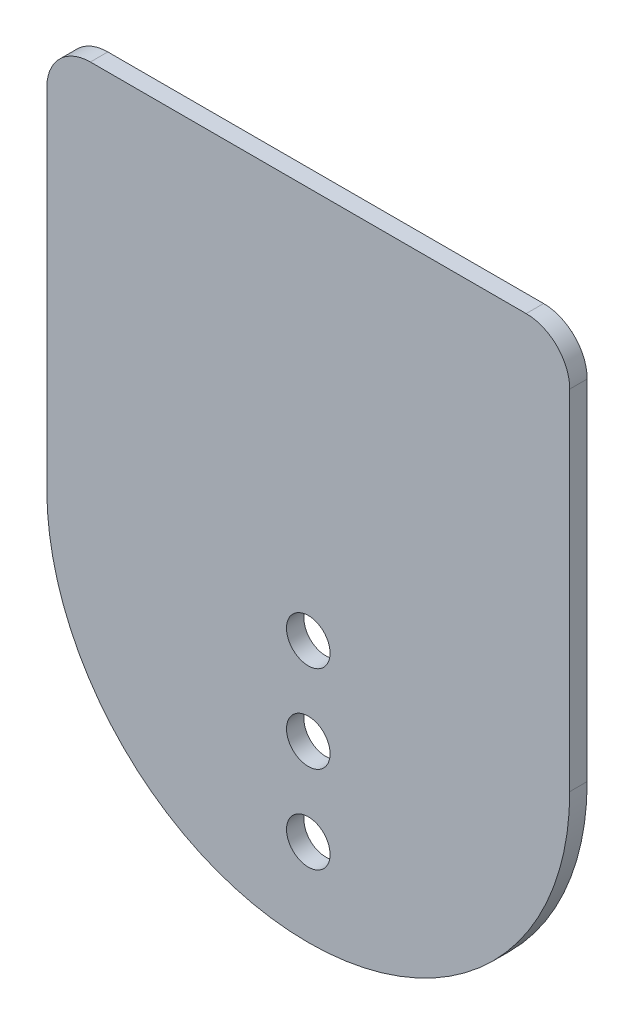
ISO-10303-21;
HEADER;
FILE_DESCRIPTION(('STEP AP214'),'2;1');
FILE_NAME('part.step','',(''),(''),'','','');
FILE_SCHEMA(('AUTOMOTIVE_DESIGN { 1 0 10303 214 1 1 1 1 }'));
ENDSEC;
DATA;
#1=APPLICATION_CONTEXT('core data for automotive mechanical design processes');
#2=APPLICATION_PROTOCOL_DEFINITION('international standard','automotive_design',2000,#1);
#3=PRODUCT_CONTEXT('',#1,'mechanical');
#4=PRODUCT('Part','Part','',(#3));
#5=PRODUCT_RELATED_PRODUCT_CATEGORY('part','',(#4));
#6=PRODUCT_DEFINITION_FORMATION('','',#4);
#7=PRODUCT_DEFINITION_CONTEXT('part definition',#1,'design');
#8=PRODUCT_DEFINITION('design','',#6,#7);
#9=PRODUCT_DEFINITION_SHAPE('','',#8);
#10=(LENGTH_UNIT() NAMED_UNIT(*) SI_UNIT(.MILLI.,.METRE.));
#11=(NAMED_UNIT(*) PLANE_ANGLE_UNIT() SI_UNIT($,.RADIAN.));
#12=(NAMED_UNIT(*) SI_UNIT($,.STERADIAN.) SOLID_ANGLE_UNIT());
#13=UNCERTAINTY_MEASURE_WITH_UNIT(LENGTH_MEASURE(1.E-05),#10,'distance_accuracy_value','');
#14=(GEOMETRIC_REPRESENTATION_CONTEXT(3) GLOBAL_UNCERTAINTY_ASSIGNED_CONTEXT((#13)) GLOBAL_UNIT_ASSIGNED_CONTEXT((#10,
#11,#12)) REPRESENTATION_CONTEXT('',''));
#15=CARTESIAN_POINT('',(0.,0.,0.));
#16=DIRECTION('',(0.,0.,1.));
#17=DIRECTION('',(1.,0.,0.));
#18=AXIS2_PLACEMENT_3D('',#15,#16,#17);
#19=CARTESIAN_POINT('',(10.,-10.,2.));
#20=DIRECTION('',(0.,0.,-1.));
#21=DIRECTION('',(-1.,0.,0.));
#22=AXIS2_PLACEMENT_3D('',#19,#20,#21);
#23=PLANE('',#22);
#24=CARTESIAN_POINT('',(10.,-10.,2.));
#25=DIRECTION('',(0.,0.,1.));
#26=DIRECTION('',(-1.,0.,0.));
#27=AXIS2_PLACEMENT_3D('',#24,#25,#26);
#28=CIRCLE('',#27,10.);
#29=CARTESIAN_POINT('',(10.0000000000001,0.,2.));
#30=VERTEX_POINT('',#29);
#31=CARTESIAN_POINT('',(0.,-10.0000000000001,2.));
#32=VERTEX_POINT('',#31);
#33=EDGE_CURVE('E136',#30,#32,#28,.T.);
#34=ORIENTED_EDGE('',*,*,#33,.T.);
#35=DIRECTION('',(0.,-1.,0.));
#36=VECTOR('',#35,1.);
#37=CARTESIAN_POINT('',(0.,-10.0000000000001,2.));
#38=LINE('',#37,#36);
#39=CARTESIAN_POINT('',(0.,-90.,2.));
#40=VERTEX_POINT('',#39);
#41=EDGE_CURVE('E93',#32,#40,#38,.T.);
#42=ORIENTED_EDGE('',*,*,#41,.T.);
#43=CARTESIAN_POINT('',(60.,-90.,2.));
#44=DIRECTION('',(0.,0.,1.));
#45=DIRECTION('',(-1.,0.,0.));
#46=AXIS2_PLACEMENT_3D('',#43,#44,#45);
#47=CIRCLE('',#46,60.);
#48=CARTESIAN_POINT('',(120.,-90.,2.));
#49=VERTEX_POINT('',#48);
#50=EDGE_CURVE('E106',#40,#49,#47,.T.);
#51=ORIENTED_EDGE('',*,*,#50,.T.);
#52=DIRECTION('',(0.,1.,0.));
#53=VECTOR('',#52,1.);
#54=CARTESIAN_POINT('',(120.,-10.,2.));
#55=LINE('',#54,#53);
#56=CARTESIAN_POINT('',(120.,-10.,2.));
#57=VERTEX_POINT('',#56);
#58=EDGE_CURVE('E100',#49,#57,#55,.T.);
#59=ORIENTED_EDGE('',*,*,#58,.T.);
#60=CARTESIAN_POINT('',(110.,-10.,2.));
#61=DIRECTION('',(0.,0.,1.));
#62=DIRECTION('',(1.,0.,0.));
#63=AXIS2_PLACEMENT_3D('',#60,#61,#62);
#64=CIRCLE('',#63,10.);
#65=CARTESIAN_POINT('',(110.,0.,2.));
#66=VERTEX_POINT('',#65);
#67=EDGE_CURVE('E104',#57,#66,#64,.T.);
#68=ORIENTED_EDGE('',*,*,#67,.T.);
#69=DIRECTION('',(-1.,0.,0.));
#70=VECTOR('',#69,1.);
#71=CARTESIAN_POINT('',(10.0000000000001,0.,2.));
#72=LINE('',#71,#70);
#73=EDGE_CURVE('E56',#66,#30,#72,.T.);
#74=ORIENTED_EDGE('',*,*,#73,.T.);
#75=EDGE_LOOP('',(#34,#42,#51,#59,#68,#74));
#76=FACE_BOUND('',#75,.T.);
#77=CARTESIAN_POINT('',(60.0000000000001,-130.,2.));
#78=DIRECTION('',(0.,0.,1.));
#79=DIRECTION('',(1.,0.,0.));
#80=AXIS2_PLACEMENT_3D('',#77,#78,#79);
#81=CIRCLE('',#80,5.);
#82=CARTESIAN_POINT('',(65.0000000000001,-130.,2.));
#83=VERTEX_POINT('',#82);
#84=EDGE_CURVE('E128',#83,#83,#81,.T.);
#85=ORIENTED_EDGE('',*,*,#84,.F.);
#86=EDGE_LOOP('',(#85));
#87=FACE_BOUND('',#86,.T.);
#88=CARTESIAN_POINT('',(60.0000000000001,-110.,2.));
#89=DIRECTION('',(0.,0.,1.));
#90=DIRECTION('',(1.,0.,0.));
#91=AXIS2_PLACEMENT_3D('',#88,#89,#90);
#92=CIRCLE('',#91,5.);
#93=CARTESIAN_POINT('',(65.0000000000001,-110.,2.));
#94=VERTEX_POINT('',#93);
#95=EDGE_CURVE('E190',#94,#94,#92,.T.);
#96=ORIENTED_EDGE('',*,*,#95,.F.);
#97=EDGE_LOOP('',(#96));
#98=FACE_BOUND('',#97,.T.);
#99=CARTESIAN_POINT('',(60.,-90.,2.));
#100=DIRECTION('',(0.,0.,1.));
#101=DIRECTION('',(1.,0.,0.));
#102=AXIS2_PLACEMENT_3D('',#99,#100,#101);
#103=CIRCLE('',#102,5.);
#104=CARTESIAN_POINT('',(65.,-90.,2.));
#105=VERTEX_POINT('',#104);
#106=EDGE_CURVE('E181',#105,#105,#103,.T.);
#107=ORIENTED_EDGE('',*,*,#106,.F.);
#108=EDGE_LOOP('',(#107));
#109=FACE_BOUND('',#108,.T.);
#110=ADVANCED_FACE('F39',(#76,#87,#98,#109),#23,.F.);
#111=CARTESIAN_POINT('',(10.,-10.,-2.));
#112=DIRECTION('',(0.,0.,-1.));
#113=DIRECTION('',(-1.,0.,0.));
#114=AXIS2_PLACEMENT_3D('',#111,#112,#113);
#115=PLANE('',#114);
#116=CARTESIAN_POINT('',(60.0000000000001,-110.,-2.));
#117=DIRECTION('',(0.,0.,1.));
#118=DIRECTION('',(1.,0.,0.));
#119=AXIS2_PLACEMENT_3D('',#116,#117,#118);
#120=CIRCLE('',#119,5.);
#121=CARTESIAN_POINT('',(65.0000000000001,-110.,-2.));
#122=VERTEX_POINT('',#121);
#123=EDGE_CURVE('E187',#122,#122,#120,.T.);
#124=ORIENTED_EDGE('',*,*,#123,.T.);
#125=EDGE_LOOP('',(#124));
#126=FACE_BOUND('',#125,.T.);
#127=CARTESIAN_POINT('',(10.,-10.,-2.));
#128=DIRECTION('',(0.,0.,1.));
#129=DIRECTION('',(-1.,0.,0.));
#130=AXIS2_PLACEMENT_3D('',#127,#128,#129);
#131=CIRCLE('',#130,10.);
#132=CARTESIAN_POINT('',(10.0000000000001,0.,-2.));
#133=VERTEX_POINT('',#132);
#134=CARTESIAN_POINT('',(0.,-10.0000000000001,-2.));
#135=VERTEX_POINT('',#134);
#136=EDGE_CURVE('E124',#133,#135,#131,.T.);
#137=ORIENTED_EDGE('',*,*,#136,.F.);
#138=DIRECTION('',(-1.,0.,0.));
#139=VECTOR('',#138,1.);
#140=CARTESIAN_POINT('',(10.0000000000001,0.,-2.));
#141=LINE('',#140,#139);
#142=CARTESIAN_POINT('',(110.,0.,-2.));
#143=VERTEX_POINT('',#142);
#144=EDGE_CURVE('E85',#143,#133,#141,.T.);
#145=ORIENTED_EDGE('',*,*,#144,.F.);
#146=CARTESIAN_POINT('',(110.,-10.,-2.));
#147=DIRECTION('',(0.,0.,1.));
#148=DIRECTION('',(1.,0.,0.));
#149=AXIS2_PLACEMENT_3D('',#146,#147,#148);
#150=CIRCLE('',#149,10.);
#151=CARTESIAN_POINT('',(120.,-10.,-2.));
#152=VERTEX_POINT('',#151);
#153=EDGE_CURVE('E79',#152,#143,#150,.T.);
#154=ORIENTED_EDGE('',*,*,#153,.F.);
#155=DIRECTION('',(0.,1.,0.));
#156=VECTOR('',#155,1.);
#157=CARTESIAN_POINT('',(120.,-10.,-2.));
#158=LINE('',#157,#156);
#159=CARTESIAN_POINT('',(120.,-90.,-2.));
#160=VERTEX_POINT('',#159);
#161=EDGE_CURVE('E114',#160,#152,#158,.T.);
#162=ORIENTED_EDGE('',*,*,#161,.F.);
#163=CARTESIAN_POINT('',(60.,-90.,-2.));
#164=DIRECTION('',(0.,0.,1.));
#165=DIRECTION('',(1.,0.,0.));
#166=AXIS2_PLACEMENT_3D('',#163,#164,#165);
#167=CIRCLE('',#166,60.);
#168=CARTESIAN_POINT('',(0.,-90.,-2.));
#169=VERTEX_POINT('',#168);
#170=EDGE_CURVE('E131',#169,#160,#167,.T.);
#171=ORIENTED_EDGE('',*,*,#170,.F.);
#172=DIRECTION('',(0.,-1.,0.));
#173=VECTOR('',#172,1.);
#174=CARTESIAN_POINT('',(0.,-10.0000000000001,-2.));
#175=LINE('',#174,#173);
#176=EDGE_CURVE('E127',#135,#169,#175,.T.);
#177=ORIENTED_EDGE('',*,*,#176,.F.);
#178=EDGE_LOOP('',(#137,#145,#154,#162,#171,#177));
#179=FACE_BOUND('',#178,.T.);
#180=CARTESIAN_POINT('',(60.0000000000001,-130.,-2.));
#181=DIRECTION('',(0.,0.,1.));
#182=DIRECTION('',(1.,0.,0.));
#183=AXIS2_PLACEMENT_3D('',#180,#181,#182);
#184=CIRCLE('',#183,5.);
#185=CARTESIAN_POINT('',(65.0000000000001,-130.,-2.));
#186=VERTEX_POINT('',#185);
#187=EDGE_CURVE('E193',#186,#186,#184,.T.);
#188=ORIENTED_EDGE('',*,*,#187,.T.);
#189=EDGE_LOOP('',(#188));
#190=FACE_BOUND('',#189,.T.);
#191=CARTESIAN_POINT('',(60.,-90.,-2.));
#192=DIRECTION('',(0.,0.,1.));
#193=DIRECTION('',(1.,0.,0.));
#194=AXIS2_PLACEMENT_3D('',#191,#192,#193);
#195=CIRCLE('',#194,5.);
#196=CARTESIAN_POINT('',(65.,-90.,-2.));
#197=VERTEX_POINT('',#196);
#198=EDGE_CURVE('E184',#197,#197,#195,.T.);
#199=ORIENTED_EDGE('',*,*,#198,.T.);
#200=EDGE_LOOP('',(#199));
#201=FACE_BOUND('',#200,.T.);
#202=ADVANCED_FACE('F146',(#126,#179,#190,#201),#115,.T.);
#203=CARTESIAN_POINT('',(10.,-10.,2.));
#204=DIRECTION('',(0.,0.,-1.));
#205=DIRECTION('',(-1.,0.,0.));
#206=AXIS2_PLACEMENT_3D('',#203,#204,#205);
#207=CYLINDRICAL_SURFACE('',#206,10.);
#208=ORIENTED_EDGE('',*,*,#136,.T.);
#209=DIRECTION('',(0.,0.,-1.));
#210=VECTOR('',#209,1.);
#211=CARTESIAN_POINT('',(0.,-10.0000000000001,2.));
#212=LINE('',#211,#210);
#213=EDGE_CURVE('E11',#32,#135,#212,.T.);
#214=ORIENTED_EDGE('',*,*,#213,.F.);
#215=ORIENTED_EDGE('',*,*,#33,.F.);
#216=DIRECTION('',(0.,0.,-1.));
#217=VECTOR('',#216,1.);
#218=CARTESIAN_POINT('',(10.0000000000001,0.,2.));
#219=LINE('',#218,#217);
#220=EDGE_CURVE('E120',#30,#133,#219,.T.);
#221=ORIENTED_EDGE('',*,*,#220,.T.);
#222=EDGE_LOOP('',(#208,#214,#215,#221));
#223=FACE_BOUND('',#222,.T.);
#224=ADVANCED_FACE('F41',(#223),#207,.T.);
#225=CARTESIAN_POINT('',(0.,-10.0000000000001,2.));
#226=DIRECTION('',(1.,0.,0.));
#227=DIRECTION('',(0.,1.,0.));
#228=AXIS2_PLACEMENT_3D('',#225,#226,#227);
#229=PLANE('',#228);
#230=ORIENTED_EDGE('',*,*,#176,.T.);
#231=DIRECTION('',(0.,0.,-1.));
#232=VECTOR('',#231,1.);
#233=CARTESIAN_POINT('',(0.,-90.,2.));
#234=LINE('',#233,#232);
#235=EDGE_CURVE('E48',#40,#169,#234,.T.);
#236=ORIENTED_EDGE('',*,*,#235,.F.);
#237=ORIENTED_EDGE('',*,*,#41,.F.);
#238=ORIENTED_EDGE('',*,*,#213,.T.);
#239=EDGE_LOOP('',(#230,#236,#237,#238));
#240=FACE_BOUND('',#239,.T.);
#241=ADVANCED_FACE('F142',(#240),#229,.F.);
#242=CARTESIAN_POINT('',(60.,-90.,2.));
#243=DIRECTION('',(0.,0.,-1.));
#244=DIRECTION('',(-1.,0.,0.));
#245=AXIS2_PLACEMENT_3D('',#242,#243,#244);
#246=CYLINDRICAL_SURFACE('',#245,60.);
#247=ORIENTED_EDGE('',*,*,#170,.T.);
#248=DIRECTION('',(0.,0.,-1.));
#249=VECTOR('',#248,1.);
#250=CARTESIAN_POINT('',(120.,-90.,2.));
#251=LINE('',#250,#249);
#252=EDGE_CURVE('E115',#49,#160,#251,.T.);
#253=ORIENTED_EDGE('',*,*,#252,.F.);
#254=ORIENTED_EDGE('',*,*,#50,.F.);
#255=ORIENTED_EDGE('',*,*,#235,.T.);
#256=EDGE_LOOP('',(#247,#253,#254,#255));
#257=FACE_BOUND('',#256,.T.);
#258=ADVANCED_FACE('F141',(#257),#246,.T.);
#259=CARTESIAN_POINT('',(120.,-10.,2.));
#260=DIRECTION('',(-1.,0.,0.));
#261=DIRECTION('',(0.,0.,1.));
#262=AXIS2_PLACEMENT_3D('',#259,#260,#261);
#263=PLANE('',#262);
#264=ORIENTED_EDGE('',*,*,#161,.T.);
#265=DIRECTION('',(0.,0.,-1.));
#266=VECTOR('',#265,1.);
#267=CARTESIAN_POINT('',(120.,-10.,2.));
#268=LINE('',#267,#266);
#269=EDGE_CURVE('E111',#57,#152,#268,.T.);
#270=ORIENTED_EDGE('',*,*,#269,.F.);
#271=ORIENTED_EDGE('',*,*,#58,.F.);
#272=ORIENTED_EDGE('',*,*,#252,.T.);
#273=EDGE_LOOP('',(#264,#270,#271,#272));
#274=FACE_BOUND('',#273,.T.);
#275=ADVANCED_FACE('F112',(#274),#263,.F.);
#276=CARTESIAN_POINT('',(110.,-10.,2.));
#277=DIRECTION('',(0.,0.,-1.));
#278=DIRECTION('',(-1.,0.,0.));
#279=AXIS2_PLACEMENT_3D('',#276,#277,#278);
#280=CYLINDRICAL_SURFACE('',#279,10.);
#281=ORIENTED_EDGE('',*,*,#153,.T.);
#282=DIRECTION('',(0.,0.,-1.));
#283=VECTOR('',#282,1.);
#284=CARTESIAN_POINT('',(110.,0.,2.));
#285=LINE('',#284,#283);
#286=EDGE_CURVE('E116',#66,#143,#285,.T.);
#287=ORIENTED_EDGE('',*,*,#286,.F.);
#288=ORIENTED_EDGE('',*,*,#67,.F.);
#289=ORIENTED_EDGE('',*,*,#269,.T.);
#290=EDGE_LOOP('',(#281,#287,#288,#289));
#291=FACE_BOUND('',#290,.T.);
#292=ADVANCED_FACE('F118',(#291),#280,.T.);
#293=CARTESIAN_POINT('',(10.0000000000001,0.,2.));
#294=DIRECTION('',(0.,-1.,0.));
#295=DIRECTION('',(0.,0.,-1.));
#296=AXIS2_PLACEMENT_3D('',#293,#294,#295);
#297=PLANE('',#296);
#298=ORIENTED_EDGE('',*,*,#144,.T.);
#299=ORIENTED_EDGE('',*,*,#220,.F.);
#300=ORIENTED_EDGE('',*,*,#73,.F.);
#301=ORIENTED_EDGE('',*,*,#286,.T.);
#302=EDGE_LOOP('',(#298,#299,#300,#301));
#303=FACE_BOUND('',#302,.T.);
#304=ADVANCED_FACE('F150',(#303),#297,.F.);
#305=CARTESIAN_POINT('',(60.0000000000001,-130.,2.));
#306=DIRECTION('',(0.,0.,-1.));
#307=DIRECTION('',(-1.,0.,0.));
#308=AXIS2_PLACEMENT_3D('',#305,#306,#307);
#309=CYLINDRICAL_SURFACE('',#308,5.);
#310=ORIENTED_EDGE('',*,*,#84,.T.);
#311=EDGE_LOOP('',(#310));
#312=FACE_BOUND('',#311,.T.);
#313=ORIENTED_EDGE('',*,*,#187,.F.);
#314=EDGE_LOOP('',(#313));
#315=FACE_BOUND('',#314,.T.);
#316=ADVANCED_FACE('F152',(#312,#315),#309,.F.);
#317=CARTESIAN_POINT('',(60.0000000000001,-110.,2.));
#318=DIRECTION('',(0.,0.,-1.));
#319=DIRECTION('',(-1.,0.,0.));
#320=AXIS2_PLACEMENT_3D('',#317,#318,#319);
#321=CYLINDRICAL_SURFACE('',#320,5.);
#322=ORIENTED_EDGE('',*,*,#95,.T.);
#323=EDGE_LOOP('',(#322));
#324=FACE_BOUND('',#323,.T.);
#325=ORIENTED_EDGE('',*,*,#123,.F.);
#326=EDGE_LOOP('',(#325));
#327=FACE_BOUND('',#326,.T.);
#328=ADVANCED_FACE('F158',(#324,#327),#321,.F.);
#329=CARTESIAN_POINT('',(60.,-90.,2.));
#330=DIRECTION('',(0.,0.,-1.));
#331=DIRECTION('',(-1.,0.,0.));
#332=AXIS2_PLACEMENT_3D('',#329,#330,#331);
#333=CYLINDRICAL_SURFACE('',#332,5.);
#334=ORIENTED_EDGE('',*,*,#106,.T.);
#335=EDGE_LOOP('',(#334));
#336=FACE_BOUND('',#335,.T.);
#337=ORIENTED_EDGE('',*,*,#198,.F.);
#338=EDGE_LOOP('',(#337));
#339=FACE_BOUND('',#338,.T.);
#340=ADVANCED_FACE('F172',(#336,#339),#333,.F.);
#341=CLOSED_SHELL('',(#110,#202,#224,#241,#258,#275,#292,#304,#316,#328,#340));
#342=MANIFOLD_SOLID_BREP('B2',#341);
#343=ADVANCED_BREP_SHAPE_REPRESENTATION('',(#18,#342),#14);
#344=SHAPE_DEFINITION_REPRESENTATION(#9,#343);
ENDSEC;
END-ISO-10303-21;
